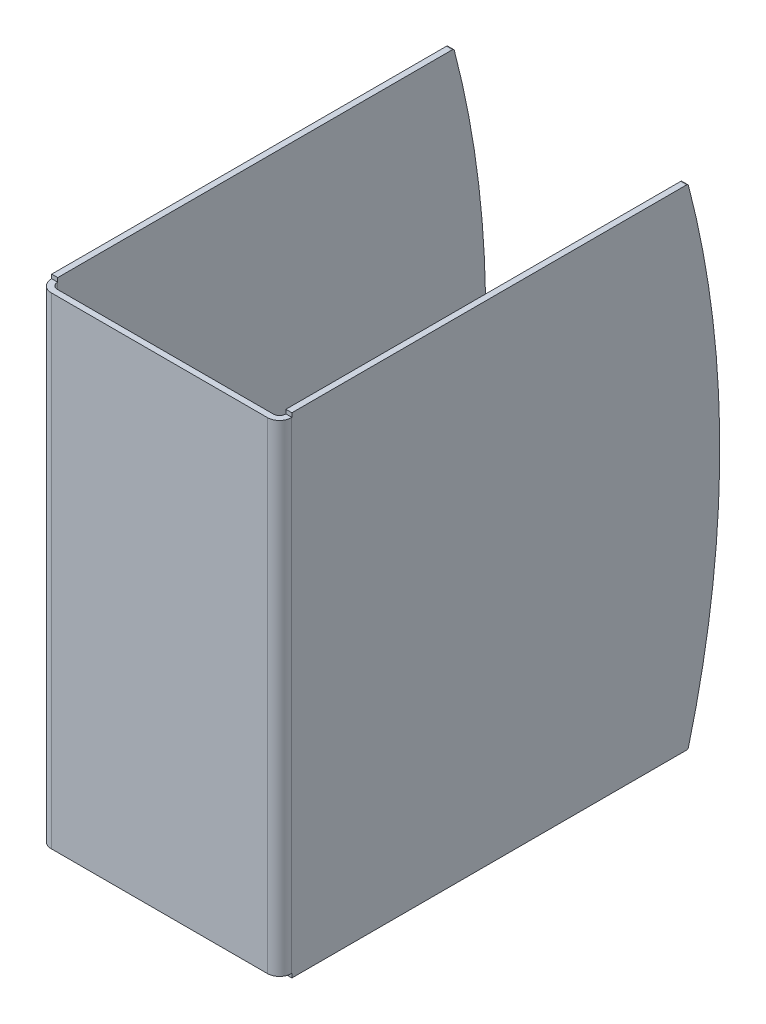
ISO-10303-21;
HEADER;
FILE_DESCRIPTION(('STEP AP214'),'2;1');
FILE_NAME('part.step','',(''),(''),'','','');
FILE_SCHEMA(('AUTOMOTIVE_DESIGN { 1 0 10303 214 1 1 1 1 }'));
ENDSEC;
DATA;
#1=APPLICATION_CONTEXT('core data for automotive mechanical design processes');
#2=APPLICATION_PROTOCOL_DEFINITION('international standard','automotive_design',2000,#1);
#3=PRODUCT_CONTEXT('',#1,'mechanical');
#4=PRODUCT('Part','Part','',(#3));
#5=PRODUCT_RELATED_PRODUCT_CATEGORY('part','',(#4));
#6=PRODUCT_DEFINITION_FORMATION('','',#4);
#7=PRODUCT_DEFINITION_CONTEXT('part definition',#1,'design');
#8=PRODUCT_DEFINITION('design','',#6,#7);
#9=PRODUCT_DEFINITION_SHAPE('','',#8);
#10=(LENGTH_UNIT() NAMED_UNIT(*) SI_UNIT(.MILLI.,.METRE.));
#11=(NAMED_UNIT(*) PLANE_ANGLE_UNIT() SI_UNIT($,.RADIAN.));
#12=(NAMED_UNIT(*) SI_UNIT($,.STERADIAN.) SOLID_ANGLE_UNIT());
#13=UNCERTAINTY_MEASURE_WITH_UNIT(LENGTH_MEASURE(1.E-05),#10,'distance_accuracy_value','');
#14=(GEOMETRIC_REPRESENTATION_CONTEXT(3) GLOBAL_UNCERTAINTY_ASSIGNED_CONTEXT((#13)) GLOBAL_UNIT_ASSIGNED_CONTEXT((#10,
#11,#12)) REPRESENTATION_CONTEXT('',''));
#15=CARTESIAN_POINT('',(0.,0.,0.));
#16=DIRECTION('',(0.,0.,1.));
#17=DIRECTION('',(1.,0.,0.));
#18=AXIS2_PLACEMENT_3D('',#15,#16,#17);
#19=CARTESIAN_POINT('',(16.0000000000003,60.65,-100.193391144417));
#20=DIRECTION('',(-1.,0.,0.));
#21=DIRECTION('',(0.,0.,1.));
#22=AXIS2_PLACEMENT_3D('',#19,#20,#21);
#23=CYLINDRICAL_SURFACE('',#22,0.500000000000014);
#24=CARTESIAN_POINT('',(16.0000000000003,60.65,-100.193391144417));
#25=DIRECTION('',(-1.,0.,0.));
#26=DIRECTION('',(0.,0.,1.));
#27=AXIS2_PLACEMENT_3D('',#24,#25,#26);
#28=CIRCLE('',#27,0.500000000000014);
#29=CARTESIAN_POINT('',(16.0000000000002,61.15,-100.193391144417));
#30=VERTEX_POINT('',#29);
#31=CARTESIAN_POINT('',(16.0000000000003,60.776617954071,-100.67709342238));
#32=VERTEX_POINT('',#31);
#33=EDGE_CURVE('E335',#30,#32,#28,.T.);
#34=ORIENTED_EDGE('',*,*,#33,.T.);
#35=DIRECTION('',(-1.,0.,0.));
#36=VECTOR('',#35,1.);
#37=CARTESIAN_POINT('',(15.9999999999996,60.7766179540709,-100.67709342238));
#38=LINE('',#37,#36);
#39=CARTESIAN_POINT('',(14.5000000000004,60.776617954071,-100.67709342238));
#40=VERTEX_POINT('',#39);
#41=EDGE_CURVE('E183',#40,#32,#38,.F.);
#42=ORIENTED_EDGE('',*,*,#41,.F.);
#43=CARTESIAN_POINT('',(14.5000000000003,60.65,-100.193391144417));
#44=DIRECTION('',(-1.,0.,0.));
#45=DIRECTION('',(0.,0.,1.));
#46=AXIS2_PLACEMENT_3D('',#43,#44,#45);
#47=CIRCLE('',#46,0.500000000000014);
#48=CARTESIAN_POINT('',(14.5000000000003,61.15,-100.193391144417));
#49=VERTEX_POINT('',#48);
#50=EDGE_CURVE('E19',#40,#49,#47,.F.);
#51=ORIENTED_EDGE('',*,*,#50,.T.);
#52=DIRECTION('',(1.,0.,0.));
#53=VECTOR('',#52,1.);
#54=CARTESIAN_POINT('',(16.,61.15,-100.193391144417));
#55=LINE('',#54,#53);
#56=EDGE_CURVE('E180',#30,#49,#55,.F.);
#57=ORIENTED_EDGE('',*,*,#56,.F.);
#58=EDGE_LOOP('',(#34,#42,#51,#57));
#59=FACE_BOUND('',#58,.T.);
#60=ADVANCED_FACE('F16',(#59),#23,.T.);
#61=CARTESIAN_POINT('',(16.0000000000004,-60.65,-100.193391144417));
#62=DIRECTION('',(-1.,0.,0.));
#63=DIRECTION('',(0.,0.,1.));
#64=AXIS2_PLACEMENT_3D('',#61,#62,#63);
#65=CYLINDRICAL_SURFACE('',#64,0.500000000000001);
#66=CARTESIAN_POINT('',(16.0000000000004,-60.65,-100.193391144417));
#67=DIRECTION('',(-1.,0.,0.));
#68=DIRECTION('',(0.,0.,1.));
#69=AXIS2_PLACEMENT_3D('',#66,#67,#68);
#70=CIRCLE('',#69,0.500000000000001);
#71=CARTESIAN_POINT('',(16.0000000000004,-60.776617954071,-100.677093422381));
#72=VERTEX_POINT('',#71);
#73=CARTESIAN_POINT('',(16.0000000000004,-61.15,-100.193391144417));
#74=VERTEX_POINT('',#73);
#75=EDGE_CURVE('E265',#72,#74,#70,.T.);
#76=ORIENTED_EDGE('',*,*,#75,.T.);
#77=DIRECTION('',(1.,0.,0.));
#78=VECTOR('',#77,1.);
#79=CARTESIAN_POINT('',(16.0000000000004,-61.15,-100.193391144417));
#80=LINE('',#79,#78);
#81=CARTESIAN_POINT('',(14.5000000000004,-61.15,-100.193391144417));
#82=VERTEX_POINT('',#81);
#83=EDGE_CURVE('E231',#82,#74,#80,.T.);
#84=ORIENTED_EDGE('',*,*,#83,.F.);
#85=CARTESIAN_POINT('',(14.5000000000004,-60.65,-100.193391144417));
#86=DIRECTION('',(-1.,0.,0.));
#87=DIRECTION('',(0.,0.,1.));
#88=AXIS2_PLACEMENT_3D('',#85,#86,#87);
#89=CIRCLE('',#88,0.500000000000001);
#90=CARTESIAN_POINT('',(14.5000000000004,-60.776617954071,-100.677093422381));
#91=VERTEX_POINT('',#90);
#92=EDGE_CURVE('E185',#82,#91,#89,.F.);
#93=ORIENTED_EDGE('',*,*,#92,.T.);
#94=DIRECTION('',(-1.,0.,0.));
#95=VECTOR('',#94,1.);
#96=CARTESIAN_POINT('',(15.9999999999996,-60.7766179540709,-100.677093422381));
#97=LINE('',#96,#95);
#98=EDGE_CURVE('E235',#72,#91,#97,.T.);
#99=ORIENTED_EDGE('',*,*,#98,.F.);
#100=EDGE_LOOP('',(#76,#84,#93,#99));
#101=FACE_BOUND('',#100,.T.);
#102=ADVANCED_FACE('F339',(#101),#65,.T.);
#103=CARTESIAN_POINT('',(16.0000000000003,60.65,-100.193391144417));
#104=DIRECTION('',(-1.,0.,0.));
#105=DIRECTION('',(0.,0.,1.));
#106=AXIS2_PLACEMENT_3D('',#103,#104,#105);
#107=PLANE('',#106);
#108=DIRECTION('',(0.,0.,-1.));
#109=VECTOR('',#108,1.);
#110=CARTESIAN_POINT('',(16.,-60.15,-1.59999999999979));
#111=LINE('',#110,#109);
#112=CARTESIAN_POINT('',(16.0000000000001,-60.15,-1.5999999999998));
#113=VERTEX_POINT('',#112);
#114=CARTESIAN_POINT('',(16.,-60.15,-1.49999999999999));
#115=VERTEX_POINT('',#114);
#116=EDGE_CURVE('E261',#113,#115,#111,.F.);
#117=ORIENTED_EDGE('',*,*,#116,.F.);
#118=DIRECTION('',(0.,1.,0.));
#119=VECTOR('',#118,1.);
#120=CARTESIAN_POINT('',(16.,-61.15,-1.59999999999979));
#121=LINE('',#120,#119);
#122=CARTESIAN_POINT('',(16.0000000000001,-61.15,-1.5999999999998));
#123=VERTEX_POINT('',#122);
#124=EDGE_CURVE('E244',#123,#113,#121,.T.);
#125=ORIENTED_EDGE('',*,*,#124,.F.);
#126=DIRECTION('',(0.,0.,-1.));
#127=VECTOR('',#126,1.);
#128=CARTESIAN_POINT('',(16.0000000000004,-61.15,-100.193391144417));
#129=LINE('',#128,#127);
#130=EDGE_CURVE('E234',#74,#123,#129,.F.);
#131=ORIENTED_EDGE('',*,*,#130,.F.);
#132=ORIENTED_EDGE('',*,*,#75,.F.);
#133=CARTESIAN_POINT('',(16.0000000000003,0.,131.5));
#134=DIRECTION('',(-1.,0.,0.));
#135=DIRECTION('',(0.,0.,1.));
#136=AXIS2_PLACEMENT_3D('',#133,#134,#135);
#137=CIRCLE('',#136,240.);
#138=EDGE_CURVE('E249',#32,#72,#137,.T.);
#139=ORIENTED_EDGE('',*,*,#138,.F.);
#140=ORIENTED_EDGE('',*,*,#33,.F.);
#141=DIRECTION('',(0.,0.,1.));
#142=VECTOR('',#141,1.);
#143=CARTESIAN_POINT('',(16.,61.15,-1.59999999999979));
#144=LINE('',#143,#142);
#145=CARTESIAN_POINT('',(16.,61.15,-1.5999999999998));
#146=VERTEX_POINT('',#145);
#147=EDGE_CURVE('E193',#146,#30,#144,.F.);
#148=ORIENTED_EDGE('',*,*,#147,.F.);
#149=DIRECTION('',(0.,1.,0.));
#150=VECTOR('',#149,1.);
#151=CARTESIAN_POINT('',(16.,60.15,-1.59999999999979));
#152=LINE('',#151,#150);
#153=CARTESIAN_POINT('',(16.,60.15,-1.59999999999979));
#154=VERTEX_POINT('',#153);
#155=EDGE_CURVE('E253',#154,#146,#152,.T.);
#156=ORIENTED_EDGE('',*,*,#155,.F.);
#157=DIRECTION('',(0.,0.,1.));
#158=VECTOR('',#157,1.);
#159=CARTESIAN_POINT('',(16.,60.15,0.));
#160=LINE('',#159,#158);
#161=CARTESIAN_POINT('',(16.,60.15,-1.49999999999999));
#162=VERTEX_POINT('',#161);
#163=EDGE_CURVE('E221',#162,#154,#160,.F.);
#164=ORIENTED_EDGE('',*,*,#163,.F.);
#165=DIRECTION('',(0.,-1.,0.));
#166=VECTOR('',#165,1.);
#167=CARTESIAN_POINT('',(16.,-60.15,-1.49999999999999));
#168=LINE('',#167,#166);
#169=EDGE_CURVE('E228',#115,#162,#168,.F.);
#170=ORIENTED_EDGE('',*,*,#169,.F.);
#171=EDGE_LOOP('',(#117,#125,#131,#132,#139,#140,#148,#156,#164,#170));
#172=FACE_BOUND('',#171,.T.);
#173=ADVANCED_FACE('F345',(#172),#107,.F.);
#174=CARTESIAN_POINT('',(16.,60.15,-1.59999999999979));
#175=DIRECTION('',(0.,0.,1.));
#176=DIRECTION('',(1.,0.,0.));
#177=AXIS2_PLACEMENT_3D('',#174,#175,#176);
#178=PLANE('',#177);
#179=ORIENTED_EDGE('',*,*,#155,.T.);
#180=DIRECTION('',(1.,0.,0.));
#181=VECTOR('',#180,1.);
#182=CARTESIAN_POINT('',(16.,61.15,-1.5999999999998));
#183=LINE('',#182,#181);
#184=CARTESIAN_POINT('',(14.5000000000004,61.15,-1.5999999999998));
#185=VERTEX_POINT('',#184);
#186=EDGE_CURVE('E251',#185,#146,#183,.T.);
#187=ORIENTED_EDGE('',*,*,#186,.F.);
#188=DIRECTION('',(0.,1.,0.));
#189=VECTOR('',#188,1.);
#190=CARTESIAN_POINT('',(14.5000000000003,60.65,-1.5999999999998));
#191=LINE('',#190,#189);
#192=CARTESIAN_POINT('',(14.5000000000002,60.15,-1.5999999999998));
#193=VERTEX_POINT('',#192);
#194=EDGE_CURVE('E199',#193,#185,#191,.T.);
#195=ORIENTED_EDGE('',*,*,#194,.F.);
#196=DIRECTION('',(1.,0.,0.));
#197=VECTOR('',#196,1.);
#198=CARTESIAN_POINT('',(16.,60.15,-1.59999999999979));
#199=LINE('',#198,#197);
#200=EDGE_CURVE('E224',#154,#193,#199,.F.);
#201=ORIENTED_EDGE('',*,*,#200,.F.);
#202=EDGE_LOOP('',(#179,#187,#195,#201));
#203=FACE_BOUND('',#202,.T.);
#204=ADVANCED_FACE('F512',(#203),#178,.T.);
#205=CARTESIAN_POINT('',(16.,61.15,-1.59999999999979));
#206=DIRECTION('',(0.,1.,0.));
#207=DIRECTION('',(0.,0.,1.));
#208=AXIS2_PLACEMENT_3D('',#205,#206,#207);
#209=PLANE('',#208);
#210=ORIENTED_EDGE('',*,*,#147,.T.);
#211=ORIENTED_EDGE('',*,*,#56,.T.);
#212=DIRECTION('',(0.,0.,1.));
#213=VECTOR('',#212,1.);
#214=CARTESIAN_POINT('',(14.5000000000003,61.15,-100.193391144417));
#215=LINE('',#214,#213);
#216=EDGE_CURVE('E190',#185,#49,#215,.F.);
#217=ORIENTED_EDGE('',*,*,#216,.F.);
#218=ORIENTED_EDGE('',*,*,#186,.T.);
#219=EDGE_LOOP('',(#210,#211,#217,#218));
#220=FACE_BOUND('',#219,.T.);
#221=ADVANCED_FACE('F188',(#220),#209,.T.);
#222=CARTESIAN_POINT('',(15.9999999999996,0.,131.5));
#223=DIRECTION('',(-1.,0.,0.));
#224=DIRECTION('',(0.,0.,1.));
#225=AXIS2_PLACEMENT_3D('',#222,#223,#224);
#226=CYLINDRICAL_SURFACE('',#225,240.);
#227=ORIENTED_EDGE('',*,*,#138,.T.);
#228=ORIENTED_EDGE('',*,*,#98,.T.);
#229=CARTESIAN_POINT('',(14.5000000000004,0.,131.5));
#230=DIRECTION('',(-1.,0.,0.));
#231=DIRECTION('',(0.,0.,1.));
#232=AXIS2_PLACEMENT_3D('',#229,#230,#231);
#233=CIRCLE('',#232,240.);
#234=EDGE_CURVE('E200',#40,#91,#233,.T.);
#235=ORIENTED_EDGE('',*,*,#234,.F.);
#236=ORIENTED_EDGE('',*,*,#41,.T.);
#237=EDGE_LOOP('',(#227,#228,#235,#236));
#238=FACE_BOUND('',#237,.T.);
#239=ADVANCED_FACE('F342',(#238),#226,.T.);
#240=CARTESIAN_POINT('',(16.0000000000004,-61.15,-100.193391144417));
#241=DIRECTION('',(0.,-1.,0.));
#242=DIRECTION('',(0.,0.,-1.));
#243=AXIS2_PLACEMENT_3D('',#240,#241,#242);
#244=PLANE('',#243);
#245=ORIENTED_EDGE('',*,*,#130,.T.);
#246=DIRECTION('',(1.,0.,0.));
#247=VECTOR('',#246,1.);
#248=CARTESIAN_POINT('',(16.,-61.15,-1.59999999999979));
#249=LINE('',#248,#247);
#250=CARTESIAN_POINT('',(14.5000000000004,-61.15,-1.5999999999998));
#251=VERTEX_POINT('',#250);
#252=EDGE_CURVE('E241',#251,#123,#249,.T.);
#253=ORIENTED_EDGE('',*,*,#252,.F.);
#254=DIRECTION('',(0.,0.,1.));
#255=VECTOR('',#254,1.);
#256=CARTESIAN_POINT('',(14.5000000000003,-61.15,-100.193391144417));
#257=LINE('',#256,#255);
#258=EDGE_CURVE('E202',#82,#251,#257,.T.);
#259=ORIENTED_EDGE('',*,*,#258,.F.);
#260=ORIENTED_EDGE('',*,*,#83,.T.);
#261=EDGE_LOOP('',(#245,#253,#259,#260));
#262=FACE_BOUND('',#261,.T.);
#263=ADVANCED_FACE('F349',(#262),#244,.T.);
#264=CARTESIAN_POINT('',(16.,-61.15,-1.59999999999979));
#265=DIRECTION('',(0.,0.,1.));
#266=DIRECTION('',(1.,0.,0.));
#267=AXIS2_PLACEMENT_3D('',#264,#265,#266);
#268=PLANE('',#267);
#269=ORIENTED_EDGE('',*,*,#124,.T.);
#270=DIRECTION('',(1.,0.,0.));
#271=VECTOR('',#270,1.);
#272=CARTESIAN_POINT('',(16.,-60.15,-1.59999999999979));
#273=LINE('',#272,#271);
#274=CARTESIAN_POINT('',(14.5000000000002,-60.15,-1.5999999999998));
#275=VERTEX_POINT('',#274);
#276=EDGE_CURVE('E225',#113,#275,#273,.F.);
#277=ORIENTED_EDGE('',*,*,#276,.T.);
#278=DIRECTION('',(0.,1.,0.));
#279=VECTOR('',#278,1.);
#280=CARTESIAN_POINT('',(14.5000000000003,60.65,-1.5999999999998));
#281=LINE('',#280,#279);
#282=EDGE_CURVE('E236',#251,#275,#281,.T.);
#283=ORIENTED_EDGE('',*,*,#282,.F.);
#284=ORIENTED_EDGE('',*,*,#252,.T.);
#285=EDGE_LOOP('',(#269,#277,#283,#284));
#286=FACE_BOUND('',#285,.T.);
#287=ADVANCED_FACE('F502',(#286),#268,.T.);
#288=CARTESIAN_POINT('',(13.,-60.15,-1.49999999999999));
#289=DIRECTION('',(0.,-1.,0.));
#290=DIRECTION('',(0.,0.,-1.));
#291=AXIS2_PLACEMENT_3D('',#288,#289,#290);
#292=CYLINDRICAL_SURFACE('',#291,2.99999999999999);
#293=CARTESIAN_POINT('',(13.,60.15,-1.49999999999999));
#294=DIRECTION('',(0.,-1.,0.));
#295=DIRECTION('',(0.,0.,-1.));
#296=AXIS2_PLACEMENT_3D('',#293,#294,#295);
#297=CIRCLE('',#296,2.99999999999999);
#298=CARTESIAN_POINT('',(13.,60.15,1.5));
#299=VERTEX_POINT('',#298);
#300=EDGE_CURVE('E220',#299,#162,#297,.F.);
#301=ORIENTED_EDGE('',*,*,#300,.F.);
#302=DIRECTION('',(0.,1.,0.));
#303=VECTOR('',#302,1.);
#304=CARTESIAN_POINT('',(13.,-60.15,1.5));
#305=LINE('',#304,#303);
#306=CARTESIAN_POINT('',(13.,-60.15,1.5));
#307=VERTEX_POINT('',#306);
#308=EDGE_CURVE('E216',#307,#299,#305,.T.);
#309=ORIENTED_EDGE('',*,*,#308,.F.);
#310=CARTESIAN_POINT('',(13.,-60.15,-1.49999999999999));
#311=DIRECTION('',(0.,-1.,0.));
#312=DIRECTION('',(0.,0.,-1.));
#313=AXIS2_PLACEMENT_3D('',#310,#311,#312);
#314=CIRCLE('',#313,2.99999999999999);
#315=EDGE_CURVE('E213',#307,#115,#314,.F.);
#316=ORIENTED_EDGE('',*,*,#315,.T.);
#317=ORIENTED_EDGE('',*,*,#169,.T.);
#318=EDGE_LOOP('',(#301,#309,#316,#317));
#319=FACE_BOUND('',#318,.T.);
#320=ADVANCED_FACE('F499',(#319),#292,.T.);
#321=CARTESIAN_POINT('',(14.5000000000003,60.65,-100.193391144417));
#322=DIRECTION('',(-1.,0.,0.));
#323=DIRECTION('',(0.,0.,1.));
#324=AXIS2_PLACEMENT_3D('',#321,#322,#323);
#325=PLANE('',#324);
#326=ORIENTED_EDGE('',*,*,#258,.T.);
#327=ORIENTED_EDGE('',*,*,#282,.T.);
#328=DIRECTION('',(0.,0.,-1.));
#329=VECTOR('',#328,1.);
#330=CARTESIAN_POINT('',(14.5,-60.15,-1.59999999999979));
#331=LINE('',#330,#329);
#332=CARTESIAN_POINT('',(14.5,-60.15,-1.49999999999999));
#333=VERTEX_POINT('',#332);
#334=EDGE_CURVE('E264',#333,#275,#331,.T.);
#335=ORIENTED_EDGE('',*,*,#334,.F.);
#336=DIRECTION('',(0.,-1.,0.));
#337=VECTOR('',#336,1.);
#338=CARTESIAN_POINT('',(14.5,-60.15,-1.49999999999999));
#339=LINE('',#338,#337);
#340=CARTESIAN_POINT('',(14.5000000000002,60.15,-1.49999999999999));
#341=VERTEX_POINT('',#340);
#342=EDGE_CURVE('E323',#333,#341,#339,.F.);
#343=ORIENTED_EDGE('',*,*,#342,.T.);
#344=DIRECTION('',(0.,0.,1.));
#345=VECTOR('',#344,1.);
#346=CARTESIAN_POINT('',(14.5000000000003,60.15,-100.193391144417));
#347=LINE('',#346,#345);
#348=EDGE_CURVE('E204',#341,#193,#347,.F.);
#349=ORIENTED_EDGE('',*,*,#348,.T.);
#350=ORIENTED_EDGE('',*,*,#194,.T.);
#351=ORIENTED_EDGE('',*,*,#216,.T.);
#352=ORIENTED_EDGE('',*,*,#50,.F.);
#353=ORIENTED_EDGE('',*,*,#234,.T.);
#354=ORIENTED_EDGE('',*,*,#92,.F.);
#355=EDGE_LOOP('',(#326,#327,#335,#343,#349,#350,#351,#352,#353,#354));
#356=FACE_BOUND('',#355,.T.);
#357=ADVANCED_FACE('F196',(#356),#325,.T.);
#358=CARTESIAN_POINT('',(-44.,-60.15,1.5));
#359=DIRECTION('',(0.,0.,1.));
#360=DIRECTION('',(1.,0.,0.));
#361=AXIS2_PLACEMENT_3D('',#358,#359,#360);
#362=PLANE('',#361);
#363=DIRECTION('',(0.,1.,0.));
#364=VECTOR('',#363,1.);
#365=CARTESIAN_POINT('',(-41.,60.15,1.5));
#366=LINE('',#365,#364);
#367=CARTESIAN_POINT('',(-41.,-60.15,1.5));
#368=VERTEX_POINT('',#367);
#369=CARTESIAN_POINT('',(-41.,60.15,1.5));
#370=VERTEX_POINT('',#369);
#371=EDGE_CURVE('E320',#368,#370,#366,.T.);
#372=ORIENTED_EDGE('',*,*,#371,.F.);
#373=DIRECTION('',(1.,0.,0.));
#374=VECTOR('',#373,1.);
#375=CARTESIAN_POINT('',(-44.,-60.15,1.5));
#376=LINE('',#375,#374);
#377=EDGE_CURVE('E327',#368,#307,#376,.T.);
#378=ORIENTED_EDGE('',*,*,#377,.T.);
#379=ORIENTED_EDGE('',*,*,#308,.T.);
#380=DIRECTION('',(1.,0.,0.));
#381=VECTOR('',#380,1.);
#382=CARTESIAN_POINT('',(-44.,60.15,1.5));
#383=LINE('',#382,#381);
#384=EDGE_CURVE('E219',#299,#370,#383,.F.);
#385=ORIENTED_EDGE('',*,*,#384,.T.);
#386=EDGE_LOOP('',(#372,#378,#379,#385));
#387=FACE_BOUND('',#386,.T.);
#388=ADVANCED_FACE('F497',(#387),#362,.T.);
#389=CARTESIAN_POINT('',(13.,-60.15,-1.49999999999999));
#390=DIRECTION('',(0.,-1.,0.));
#391=DIRECTION('',(0.,0.,-1.));
#392=AXIS2_PLACEMENT_3D('',#389,#390,#391);
#393=CYLINDRICAL_SURFACE('',#392,1.49999999999999);
#394=CARTESIAN_POINT('',(13.,60.15,-1.49999999999999));
#395=DIRECTION('',(0.,-1.,0.));
#396=DIRECTION('',(0.,0.,-1.));
#397=AXIS2_PLACEMENT_3D('',#394,#395,#396);
#398=CIRCLE('',#397,1.49999999999999);
#399=CARTESIAN_POINT('',(13.,60.15,0.));
#400=VERTEX_POINT('',#399);
#401=EDGE_CURVE('E321',#341,#400,#398,.T.);
#402=ORIENTED_EDGE('',*,*,#401,.F.);
#403=ORIENTED_EDGE('',*,*,#342,.F.);
#404=CARTESIAN_POINT('',(13.,-60.15,-1.49999999999999));
#405=DIRECTION('',(0.,-1.,0.));
#406=DIRECTION('',(0.,0.,-1.));
#407=AXIS2_PLACEMENT_3D('',#404,#405,#406);
#408=CIRCLE('',#407,1.49999999999999);
#409=CARTESIAN_POINT('',(13.,-60.15,0.));
#410=VERTEX_POINT('',#409);
#411=EDGE_CURVE('E324',#410,#333,#408,.F.);
#412=ORIENTED_EDGE('',*,*,#411,.F.);
#413=DIRECTION('',(0.,1.,0.));
#414=VECTOR('',#413,1.);
#415=CARTESIAN_POINT('',(13.,-60.15,0.));
#416=LINE('',#415,#414);
#417=EDGE_CURVE('E359',#410,#400,#416,.T.);
#418=ORIENTED_EDGE('',*,*,#417,.T.);
#419=EDGE_LOOP('',(#402,#403,#412,#418));
#420=FACE_BOUND('',#419,.T.);
#421=ADVANCED_FACE('F508',(#420),#393,.F.);
#422=CARTESIAN_POINT('',(-41.,60.15,-1.49999999999999));
#423=DIRECTION('',(0.,1.,0.));
#424=DIRECTION('',(0.,0.,1.));
#425=AXIS2_PLACEMENT_3D('',#422,#423,#424);
#426=CYLINDRICAL_SURFACE('',#425,3.);
#427=CARTESIAN_POINT('',(-41.,-60.15,-1.49999999999999));
#428=DIRECTION('',(0.,1.,0.));
#429=DIRECTION('',(0.,0.,1.));
#430=AXIS2_PLACEMENT_3D('',#427,#428,#429);
#431=CIRCLE('',#430,3.);
#432=CARTESIAN_POINT('',(-44.0000000000002,-60.15,-1.49999999999999));
#433=VERTEX_POINT('',#432);
#434=EDGE_CURVE('E315',#368,#433,#431,.F.);
#435=ORIENTED_EDGE('',*,*,#434,.F.);
#436=ORIENTED_EDGE('',*,*,#371,.T.);
#437=CARTESIAN_POINT('',(-41.,60.15,-1.49999999999999));
#438=DIRECTION('',(0.,1.,0.));
#439=DIRECTION('',(0.,0.,1.));
#440=AXIS2_PLACEMENT_3D('',#437,#438,#439);
#441=CIRCLE('',#440,3.);
#442=CARTESIAN_POINT('',(-44.0000000000002,60.15,-1.49999999999999));
#443=VERTEX_POINT('',#442);
#444=EDGE_CURVE('E318',#370,#443,#441,.F.);
#445=ORIENTED_EDGE('',*,*,#444,.T.);
#446=DIRECTION('',(0.,1.,0.));
#447=VECTOR('',#446,1.);
#448=CARTESIAN_POINT('',(-44.0000000000003,60.65,-1.49999999999999));
#449=LINE('',#448,#447);
#450=EDGE_CURVE('E363',#443,#433,#449,.F.);
#451=ORIENTED_EDGE('',*,*,#450,.T.);
#452=EDGE_LOOP('',(#435,#436,#445,#451));
#453=FACE_BOUND('',#452,.T.);
#454=ADVANCED_FACE('F494',(#453),#426,.T.);
#455=CARTESIAN_POINT('',(-44.,-60.15,0.));
#456=DIRECTION('',(0.,0.,1.));
#457=DIRECTION('',(1.,0.,0.));
#458=AXIS2_PLACEMENT_3D('',#455,#456,#457);
#459=PLANE('',#458);
#460=DIRECTION('',(1.,0.,0.));
#461=VECTOR('',#460,1.);
#462=CARTESIAN_POINT('',(-44.,-60.15,0.));
#463=LINE('',#462,#461);
#464=CARTESIAN_POINT('',(-41.,-60.15,0.));
#465=VERTEX_POINT('',#464);
#466=EDGE_CURVE('E362',#465,#410,#463,.T.);
#467=ORIENTED_EDGE('',*,*,#466,.F.);
#468=DIRECTION('',(0.,1.,0.));
#469=VECTOR('',#468,1.);
#470=CARTESIAN_POINT('',(-41.,60.15,0.));
#471=LINE('',#470,#469);
#472=CARTESIAN_POINT('',(-41.,60.15,0.));
#473=VERTEX_POINT('',#472);
#474=EDGE_CURVE('E299',#465,#473,#471,.T.);
#475=ORIENTED_EDGE('',*,*,#474,.T.);
#476=DIRECTION('',(1.,0.,0.));
#477=VECTOR('',#476,1.);
#478=CARTESIAN_POINT('',(-44.,60.15,0.));
#479=LINE('',#478,#477);
#480=EDGE_CURVE('E317',#400,#473,#479,.F.);
#481=ORIENTED_EDGE('',*,*,#480,.F.);
#482=ORIENTED_EDGE('',*,*,#417,.F.);
#483=EDGE_LOOP('',(#467,#475,#481,#482));
#484=FACE_BOUND('',#483,.T.);
#485=ADVANCED_FACE('F549',(#484),#459,.F.);
#486=CARTESIAN_POINT('',(-44.,-60.15,-1.6));
#487=DIRECTION('',(0.,-1.,0.));
#488=DIRECTION('',(0.,0.,-1.));
#489=AXIS2_PLACEMENT_3D('',#486,#487,#488);
#490=PLANE('',#489);
#491=DIRECTION('',(0.,0.,-1.));
#492=VECTOR('',#491,1.);
#493=CARTESIAN_POINT('',(-44.0000000000003,-60.15,-100.193391144417));
#494=LINE('',#493,#492);
#495=CARTESIAN_POINT('',(-44.0000000000001,-60.15,-1.6));
#496=VERTEX_POINT('',#495);
#497=EDGE_CURVE('E309',#433,#496,#494,.T.);
#498=ORIENTED_EDGE('',*,*,#497,.T.);
#499=DIRECTION('',(1.,0.,0.));
#500=VECTOR('',#499,1.);
#501=CARTESIAN_POINT('',(-44.,-60.15,-1.6));
#502=LINE('',#501,#500);
#503=CARTESIAN_POINT('',(-42.5000000000002,-60.15,-1.6));
#504=VERTEX_POINT('',#503);
#505=EDGE_CURVE('E383',#504,#496,#502,.F.);
#506=ORIENTED_EDGE('',*,*,#505,.F.);
#507=DIRECTION('',(0.,0.,-1.));
#508=VECTOR('',#507,1.);
#509=CARTESIAN_POINT('',(-42.5,-60.15,-1.6));
#510=LINE('',#509,#508);
#511=CARTESIAN_POINT('',(-42.5000000000002,-60.15,-1.49999999999999));
#512=VERTEX_POINT('',#511);
#513=EDGE_CURVE('E314',#504,#512,#510,.F.);
#514=ORIENTED_EDGE('',*,*,#513,.T.);
#515=CARTESIAN_POINT('',(-41.,-60.15,-1.49999999999999));
#516=DIRECTION('',(0.,1.,0.));
#517=DIRECTION('',(0.,0.,1.));
#518=AXIS2_PLACEMENT_3D('',#515,#516,#517);
#519=CIRCLE('',#518,1.49999999999999);
#520=EDGE_CURVE('E297',#512,#465,#519,.T.);
#521=ORIENTED_EDGE('',*,*,#520,.T.);
#522=ORIENTED_EDGE('',*,*,#466,.T.);
#523=ORIENTED_EDGE('',*,*,#411,.T.);
#524=ORIENTED_EDGE('',*,*,#334,.T.);
#525=ORIENTED_EDGE('',*,*,#276,.F.);
#526=ORIENTED_EDGE('',*,*,#116,.T.);
#527=ORIENTED_EDGE('',*,*,#315,.F.);
#528=ORIENTED_EDGE('',*,*,#377,.F.);
#529=ORIENTED_EDGE('',*,*,#434,.T.);
#530=EDGE_LOOP('',(#498,#506,#514,#521,#522,#523,#524,#525,#526,#527,#528,#529));
#531=FACE_BOUND('',#530,.T.);
#532=ADVANCED_FACE('F473',(#531),#490,.T.);
#533=CARTESIAN_POINT('',(-44.0000000000003,-60.65,-100.193391144417));
#534=DIRECTION('',(1.,0.,0.));
#535=DIRECTION('',(0.,0.,-1.));
#536=AXIS2_PLACEMENT_3D('',#533,#534,#535);
#537=CYLINDRICAL_SURFACE('',#536,0.500000000000001);
#538=CARTESIAN_POINT('',(-44.0000000000003,-60.65,-100.193391144417));
#539=DIRECTION('',(1.,0.,0.));
#540=DIRECTION('',(0.,0.,-1.));
#541=AXIS2_PLACEMENT_3D('',#538,#539,#540);
#542=CIRCLE('',#541,0.500000000000001);
#543=CARTESIAN_POINT('',(-44.0000000000002,-61.15,-100.193391144417));
#544=VERTEX_POINT('',#543);
#545=CARTESIAN_POINT('',(-44.0000000000003,-60.776617954071,-100.677093422381));
#546=VERTEX_POINT('',#545);
#547=EDGE_CURVE('E307',#544,#546,#542,.T.);
#548=ORIENTED_EDGE('',*,*,#547,.T.);
#549=DIRECTION('',(1.,0.,0.));
#550=VECTOR('',#549,1.);
#551=CARTESIAN_POINT('',(-43.9999999999995,-60.7766179540711,-100.677093422381));
#552=LINE('',#551,#550);
#553=CARTESIAN_POINT('',(-42.5000000000003,-60.776617954071,-100.677093422381));
#554=VERTEX_POINT('',#553);
#555=EDGE_CURVE('E426',#554,#546,#552,.F.);
#556=ORIENTED_EDGE('',*,*,#555,.F.);
#557=CARTESIAN_POINT('',(-42.5000000000003,-60.65,-100.193391144417));
#558=DIRECTION('',(1.,0.,0.));
#559=DIRECTION('',(0.,0.,-1.));
#560=AXIS2_PLACEMENT_3D('',#557,#558,#559);
#561=CIRCLE('',#560,0.500000000000001);
#562=CARTESIAN_POINT('',(-42.5000000000003,-61.15,-100.193391144417));
#563=VERTEX_POINT('',#562);
#564=EDGE_CURVE('E312',#554,#563,#561,.F.);
#565=ORIENTED_EDGE('',*,*,#564,.T.);
#566=DIRECTION('',(1.,0.,0.));
#567=VECTOR('',#566,1.);
#568=CARTESIAN_POINT('',(-44.,-61.15,-100.193391144417));
#569=LINE('',#568,#567);
#570=EDGE_CURVE('E296',#544,#563,#569,.T.);
#571=ORIENTED_EDGE('',*,*,#570,.F.);
#572=EDGE_LOOP('',(#548,#556,#565,#571));
#573=FACE_BOUND('',#572,.T.);
#574=ADVANCED_FACE('F484',(#573),#537,.T.);
#575=CARTESIAN_POINT('',(-44.0000000000003,60.65,-100.193391144417));
#576=DIRECTION('',(1.,0.,0.));
#577=DIRECTION('',(0.,0.,-1.));
#578=AXIS2_PLACEMENT_3D('',#575,#576,#577);
#579=CYLINDRICAL_SURFACE('',#578,0.500000000000001);
#580=CARTESIAN_POINT('',(-44.0000000000003,60.65,-100.193391144417));
#581=DIRECTION('',(1.,0.,0.));
#582=DIRECTION('',(0.,0.,-1.));
#583=AXIS2_PLACEMENT_3D('',#580,#581,#582);
#584=CIRCLE('',#583,0.500000000000001);
#585=CARTESIAN_POINT('',(-44.0000000000003,60.776617954071,-100.677093422381));
#586=VERTEX_POINT('',#585);
#587=CARTESIAN_POINT('',(-44.0000000000003,61.15,-100.193391144417));
#588=VERTEX_POINT('',#587);
#589=EDGE_CURVE('E304',#586,#588,#584,.T.);
#590=ORIENTED_EDGE('',*,*,#589,.T.);
#591=DIRECTION('',(1.,0.,0.));
#592=VECTOR('',#591,1.);
#593=CARTESIAN_POINT('',(-44.,61.15,-100.193391144417));
#594=LINE('',#593,#592);
#595=CARTESIAN_POINT('',(-42.5000000000003,61.15,-100.193391144417));
#596=VERTEX_POINT('',#595);
#597=EDGE_CURVE('E411',#596,#588,#594,.F.);
#598=ORIENTED_EDGE('',*,*,#597,.F.);
#599=CARTESIAN_POINT('',(-42.5000000000003,60.65,-100.193391144417));
#600=DIRECTION('',(1.,0.,0.));
#601=DIRECTION('',(0.,0.,-1.));
#602=AXIS2_PLACEMENT_3D('',#599,#600,#601);
#603=CIRCLE('',#602,0.500000000000001);
#604=CARTESIAN_POINT('',(-42.5000000000003,60.776617954071,-100.677093422381));
#605=VERTEX_POINT('',#604);
#606=EDGE_CURVE('E310',#596,#605,#603,.F.);
#607=ORIENTED_EDGE('',*,*,#606,.T.);
#608=DIRECTION('',(1.,0.,0.));
#609=VECTOR('',#608,1.);
#610=CARTESIAN_POINT('',(-43.9999999999995,60.776617954071,-100.677093422381));
#611=LINE('',#610,#609);
#612=EDGE_CURVE('E295',#586,#605,#611,.T.);
#613=ORIENTED_EDGE('',*,*,#612,.F.);
#614=EDGE_LOOP('',(#590,#598,#607,#613));
#615=FACE_BOUND('',#614,.T.);
#616=ADVANCED_FACE('F451',(#615),#579,.T.);
#617=CARTESIAN_POINT('',(-44.0000000000003,60.65,-100.193391144417));
#618=DIRECTION('',(1.,0.,0.));
#619=DIRECTION('',(0.,0.,-1.));
#620=AXIS2_PLACEMENT_3D('',#617,#618,#619);
#621=PLANE('',#620);
#622=DIRECTION('',(0.,0.,1.));
#623=VECTOR('',#622,1.);
#624=CARTESIAN_POINT('',(-44.,60.15,0.));
#625=LINE('',#624,#623);
#626=CARTESIAN_POINT('',(-44.0000000000001,60.15,-1.6));
#627=VERTEX_POINT('',#626);
#628=EDGE_CURVE('E366',#627,#443,#625,.T.);
#629=ORIENTED_EDGE('',*,*,#628,.F.);
#630=DIRECTION('',(0.,1.,0.));
#631=VECTOR('',#630,1.);
#632=CARTESIAN_POINT('',(-44.0000000000003,60.65,-1.6));
#633=LINE('',#632,#631);
#634=CARTESIAN_POINT('',(-44.0000000000002,61.15,-1.6));
#635=VERTEX_POINT('',#634);
#636=EDGE_CURVE('E306',#635,#627,#633,.F.);
#637=ORIENTED_EDGE('',*,*,#636,.F.);
#638=DIRECTION('',(0.,0.,1.));
#639=VECTOR('',#638,1.);
#640=CARTESIAN_POINT('',(-44.0000000000003,61.15,-1.6));
#641=LINE('',#640,#639);
#642=EDGE_CURVE('E409',#588,#635,#641,.T.);
#643=ORIENTED_EDGE('',*,*,#642,.F.);
#644=ORIENTED_EDGE('',*,*,#589,.F.);
#645=CARTESIAN_POINT('',(-44.0000000000003,0.,131.5));
#646=DIRECTION('',(1.,0.,0.));
#647=DIRECTION('',(0.,0.,-1.));
#648=AXIS2_PLACEMENT_3D('',#645,#646,#647);
#649=CIRCLE('',#648,240.);
#650=EDGE_CURVE('E292',#546,#586,#649,.T.);
#651=ORIENTED_EDGE('',*,*,#650,.F.);
#652=ORIENTED_EDGE('',*,*,#547,.F.);
#653=DIRECTION('',(0.,0.,-1.));
#654=VECTOR('',#653,1.);
#655=CARTESIAN_POINT('',(-44.,-61.15,-1.6));
#656=LINE('',#655,#654);
#657=CARTESIAN_POINT('',(-44.,-61.15,-1.6));
#658=VERTEX_POINT('',#657);
#659=EDGE_CURVE('E401',#658,#544,#656,.T.);
#660=ORIENTED_EDGE('',*,*,#659,.F.);
#661=DIRECTION('',(0.,1.,0.));
#662=VECTOR('',#661,1.);
#663=CARTESIAN_POINT('',(-44.,-60.15,-1.6));
#664=LINE('',#663,#662);
#665=EDGE_CURVE('E396',#496,#658,#664,.F.);
#666=ORIENTED_EDGE('',*,*,#665,.F.);
#667=ORIENTED_EDGE('',*,*,#497,.F.);
#668=ORIENTED_EDGE('',*,*,#450,.F.);
#669=EDGE_LOOP('',(#629,#637,#643,#644,#651,#652,#660,#666,#667,#668));
#670=FACE_BOUND('',#669,.T.);
#671=ADVANCED_FACE('F456',(#670),#621,.F.);
#672=CARTESIAN_POINT('',(-44.,60.15,0.));
#673=DIRECTION('',(0.,1.,0.));
#674=DIRECTION('',(0.,0.,1.));
#675=AXIS2_PLACEMENT_3D('',#672,#673,#674);
#676=PLANE('',#675);
#677=DIRECTION('',(0.,0.,1.));
#678=VECTOR('',#677,1.);
#679=CARTESIAN_POINT('',(-42.5,60.15,0.));
#680=LINE('',#679,#678);
#681=CARTESIAN_POINT('',(-42.5000000000002,60.15,-1.49999999999999));
#682=VERTEX_POINT('',#681);
#683=CARTESIAN_POINT('',(-42.5000000000002,60.15,-1.6));
#684=VERTEX_POINT('',#683);
#685=EDGE_CURVE('E303',#682,#684,#680,.F.);
#686=ORIENTED_EDGE('',*,*,#685,.T.);
#687=DIRECTION('',(1.,0.,0.));
#688=VECTOR('',#687,1.);
#689=CARTESIAN_POINT('',(-44.,60.15,-1.6));
#690=LINE('',#689,#688);
#691=EDGE_CURVE('E373',#627,#684,#690,.T.);
#692=ORIENTED_EDGE('',*,*,#691,.F.);
#693=ORIENTED_EDGE('',*,*,#628,.T.);
#694=ORIENTED_EDGE('',*,*,#444,.F.);
#695=ORIENTED_EDGE('',*,*,#384,.F.);
#696=ORIENTED_EDGE('',*,*,#300,.T.);
#697=ORIENTED_EDGE('',*,*,#163,.T.);
#698=ORIENTED_EDGE('',*,*,#200,.T.);
#699=ORIENTED_EDGE('',*,*,#348,.F.);
#700=ORIENTED_EDGE('',*,*,#401,.T.);
#701=ORIENTED_EDGE('',*,*,#480,.T.);
#702=CARTESIAN_POINT('',(-41.,60.15,-1.49999999999999));
#703=DIRECTION('',(0.,1.,0.));
#704=DIRECTION('',(0.,0.,1.));
#705=AXIS2_PLACEMENT_3D('',#702,#703,#704);
#706=CIRCLE('',#705,1.49999999999999);
#707=EDGE_CURVE('E300',#473,#682,#706,.F.);
#708=ORIENTED_EDGE('',*,*,#707,.T.);
#709=EDGE_LOOP('',(#686,#692,#693,#694,#695,#696,#697,#698,#699,#700,#701,#708));
#710=FACE_BOUND('',#709,.T.);
#711=ADVANCED_FACE('F462',(#710),#676,.T.);
#712=CARTESIAN_POINT('',(-41.,60.15,-1.49999999999999));
#713=DIRECTION('',(0.,1.,0.));
#714=DIRECTION('',(0.,0.,1.));
#715=AXIS2_PLACEMENT_3D('',#712,#713,#714);
#716=CYLINDRICAL_SURFACE('',#715,1.49999999999999);
#717=ORIENTED_EDGE('',*,*,#520,.F.);
#718=DIRECTION('',(0.,1.,0.));
#719=VECTOR('',#718,1.);
#720=CARTESIAN_POINT('',(-42.5000000000003,60.65,-1.49999999999999));
#721=LINE('',#720,#719);
#722=EDGE_CURVE('E376',#682,#512,#721,.F.);
#723=ORIENTED_EDGE('',*,*,#722,.F.);
#724=ORIENTED_EDGE('',*,*,#707,.F.);
#725=ORIENTED_EDGE('',*,*,#474,.F.);
#726=EDGE_LOOP('',(#717,#723,#724,#725));
#727=FACE_BOUND('',#726,.T.);
#728=ADVANCED_FACE('F468',(#727),#716,.F.);
#729=CARTESIAN_POINT('',(-44.,-60.15,-1.6));
#730=DIRECTION('',(0.,0.,1.));
#731=DIRECTION('',(1.,0.,0.));
#732=AXIS2_PLACEMENT_3D('',#729,#730,#731);
#733=PLANE('',#732);
#734=ORIENTED_EDGE('',*,*,#665,.T.);
#735=DIRECTION('',(1.,0.,0.));
#736=VECTOR('',#735,1.);
#737=CARTESIAN_POINT('',(-44.,-61.15,-1.6));
#738=LINE('',#737,#736);
#739=CARTESIAN_POINT('',(-42.5000000000003,-61.15,-1.6));
#740=VERTEX_POINT('',#739);
#741=EDGE_CURVE('E398',#740,#658,#738,.F.);
#742=ORIENTED_EDGE('',*,*,#741,.F.);
#743=DIRECTION('',(0.,1.,0.));
#744=VECTOR('',#743,1.);
#745=CARTESIAN_POINT('',(-42.5000000000003,60.65,-1.6));
#746=LINE('',#745,#744);
#747=EDGE_CURVE('E386',#504,#740,#746,.F.);
#748=ORIENTED_EDGE('',*,*,#747,.F.);
#749=ORIENTED_EDGE('',*,*,#505,.T.);
#750=EDGE_LOOP('',(#734,#742,#748,#749));
#751=FACE_BOUND('',#750,.T.);
#752=ADVANCED_FACE('F477',(#751),#733,.T.);
#753=CARTESIAN_POINT('',(-44.,-61.15,-1.6));
#754=DIRECTION('',(0.,-1.,0.));
#755=DIRECTION('',(0.,0.,-1.));
#756=AXIS2_PLACEMENT_3D('',#753,#754,#755);
#757=PLANE('',#756);
#758=ORIENTED_EDGE('',*,*,#659,.T.);
#759=ORIENTED_EDGE('',*,*,#570,.T.);
#760=DIRECTION('',(0.,0.,-1.));
#761=VECTOR('',#760,1.);
#762=CARTESIAN_POINT('',(-42.5000000000003,-61.15,-100.193391144417));
#763=LINE('',#762,#761);
#764=EDGE_CURVE('E291',#740,#563,#763,.T.);
#765=ORIENTED_EDGE('',*,*,#764,.F.);
#766=ORIENTED_EDGE('',*,*,#741,.T.);
#767=EDGE_LOOP('',(#758,#759,#765,#766));
#768=FACE_BOUND('',#767,.T.);
#769=ADVANCED_FACE('F481',(#768),#757,.T.);
#770=CARTESIAN_POINT('',(-43.9999999999995,0.,131.5));
#771=DIRECTION('',(1.,0.,0.));
#772=DIRECTION('',(0.,0.,-1.));
#773=AXIS2_PLACEMENT_3D('',#770,#771,#772);
#774=CYLINDRICAL_SURFACE('',#773,240.);
#775=CARTESIAN_POINT('',(-42.5000000000003,0.,131.5));
#776=DIRECTION('',(1.,0.,0.));
#777=DIRECTION('',(0.,0.,-1.));
#778=AXIS2_PLACEMENT_3D('',#775,#776,#777);
#779=CIRCLE('',#778,240.);
#780=EDGE_CURVE('E288',#554,#605,#779,.T.);
#781=ORIENTED_EDGE('',*,*,#780,.F.);
#782=ORIENTED_EDGE('',*,*,#555,.T.);
#783=ORIENTED_EDGE('',*,*,#650,.T.);
#784=ORIENTED_EDGE('',*,*,#612,.T.);
#785=EDGE_LOOP('',(#781,#782,#783,#784));
#786=FACE_BOUND('',#785,.T.);
#787=ADVANCED_FACE('F488',(#786),#774,.T.);
#788=CARTESIAN_POINT('',(-44.,61.15,-1.6));
#789=DIRECTION('',(0.,1.,0.));
#790=DIRECTION('',(0.,0.,1.));
#791=AXIS2_PLACEMENT_3D('',#788,#789,#790);
#792=PLANE('',#791);
#793=ORIENTED_EDGE('',*,*,#642,.T.);
#794=DIRECTION('',(1.,0.,0.));
#795=VECTOR('',#794,1.);
#796=CARTESIAN_POINT('',(-44.,61.15,-1.6));
#797=LINE('',#796,#795);
#798=CARTESIAN_POINT('',(-42.5000000000003,61.15,-1.6));
#799=VERTEX_POINT('',#798);
#800=EDGE_CURVE('E34',#799,#635,#797,.F.);
#801=ORIENTED_EDGE('',*,*,#800,.F.);
#802=DIRECTION('',(0.,0.,-1.));
#803=VECTOR('',#802,1.);
#804=CARTESIAN_POINT('',(-42.5000000000003,61.15,-100.193391144417));
#805=LINE('',#804,#803);
#806=EDGE_CURVE('E25',#596,#799,#805,.F.);
#807=ORIENTED_EDGE('',*,*,#806,.F.);
#808=ORIENTED_EDGE('',*,*,#597,.T.);
#809=EDGE_LOOP('',(#793,#801,#807,#808));
#810=FACE_BOUND('',#809,.T.);
#811=ADVANCED_FACE('F448',(#810),#792,.T.);
#812=CARTESIAN_POINT('',(-44.,60.15,-1.6));
#813=DIRECTION('',(0.,0.,1.));
#814=DIRECTION('',(1.,0.,0.));
#815=AXIS2_PLACEMENT_3D('',#812,#813,#814);
#816=PLANE('',#815);
#817=ORIENTED_EDGE('',*,*,#636,.T.);
#818=ORIENTED_EDGE('',*,*,#691,.T.);
#819=DIRECTION('',(0.,1.,0.));
#820=VECTOR('',#819,1.);
#821=CARTESIAN_POINT('',(-42.5000000000003,60.65,-1.6));
#822=LINE('',#821,#820);
#823=EDGE_CURVE('E11',#799,#684,#822,.F.);
#824=ORIENTED_EDGE('',*,*,#823,.F.);
#825=ORIENTED_EDGE('',*,*,#800,.T.);
#826=EDGE_LOOP('',(#817,#818,#824,#825));
#827=FACE_BOUND('',#826,.T.);
#828=ADVANCED_FACE('F460',(#827),#816,.T.);
#829=CARTESIAN_POINT('',(-42.5000000000003,60.65,-100.193391144417));
#830=DIRECTION('',(1.,0.,0.));
#831=DIRECTION('',(0.,0.,-1.));
#832=AXIS2_PLACEMENT_3D('',#829,#830,#831);
#833=PLANE('',#832);
#834=ORIENTED_EDGE('',*,*,#806,.T.);
#835=ORIENTED_EDGE('',*,*,#823,.T.);
#836=ORIENTED_EDGE('',*,*,#685,.F.);
#837=ORIENTED_EDGE('',*,*,#722,.T.);
#838=ORIENTED_EDGE('',*,*,#513,.F.);
#839=ORIENTED_EDGE('',*,*,#747,.T.);
#840=ORIENTED_EDGE('',*,*,#764,.T.);
#841=ORIENTED_EDGE('',*,*,#564,.F.);
#842=ORIENTED_EDGE('',*,*,#780,.T.);
#843=ORIENTED_EDGE('',*,*,#606,.F.);
#844=EDGE_LOOP('',(#834,#835,#836,#837,#838,#839,#840,#841,#842,#843));
#845=FACE_BOUND('',#844,.T.);
#846=ADVANCED_FACE('F446',(#845),#833,.T.);
#847=CLOSED_SHELL('',(#60,#102,#173,#204,#221,#239,#263,#287,#320,#357,#388,#421,#454,#485,#532,
#574,#616,#671,#711,#728,#752,#769,#787,#811,#828,#846));
#848=MANIFOLD_SOLID_BREP('B1',#847);
#849=ADVANCED_BREP_SHAPE_REPRESENTATION('',(#18,#848),#14);
#850=SHAPE_DEFINITION_REPRESENTATION(#9,#849);
ENDSEC;
END-ISO-10303-21;
